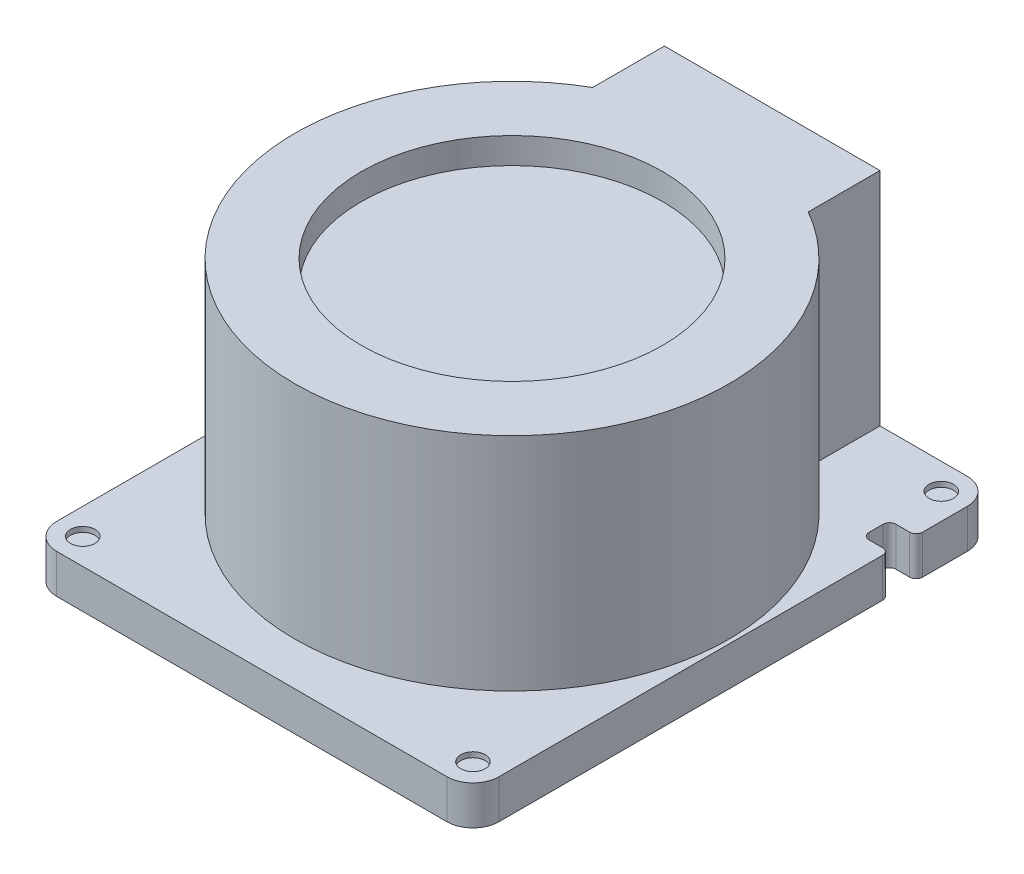
ISO-10303-21;
HEADER;
FILE_DESCRIPTION(('STEP AP214'),'2;1');
FILE_NAME('part.step','',(''),(''),'','','');
FILE_SCHEMA(('AUTOMOTIVE_DESIGN { 1 0 10303 214 1 1 1 1 }'));
ENDSEC;
DATA;
#1=APPLICATION_CONTEXT('core data for automotive mechanical design processes');
#2=APPLICATION_PROTOCOL_DEFINITION('international standard','automotive_design',2000,#1);
#3=PRODUCT_CONTEXT('',#1,'mechanical');
#4=PRODUCT('Part','Part','',(#3));
#5=PRODUCT_RELATED_PRODUCT_CATEGORY('part','',(#4));
#6=PRODUCT_DEFINITION_FORMATION('','',#4);
#7=PRODUCT_DEFINITION_CONTEXT('part definition',#1,'design');
#8=PRODUCT_DEFINITION('design','',#6,#7);
#9=PRODUCT_DEFINITION_SHAPE('','',#8);
#10=(LENGTH_UNIT() NAMED_UNIT(*) SI_UNIT(.MILLI.,.METRE.));
#11=(NAMED_UNIT(*) PLANE_ANGLE_UNIT() SI_UNIT($,.RADIAN.));
#12=(NAMED_UNIT(*) SI_UNIT($,.STERADIAN.) SOLID_ANGLE_UNIT());
#13=UNCERTAINTY_MEASURE_WITH_UNIT(LENGTH_MEASURE(1.E-05),#10,'distance_accuracy_value','');
#14=(GEOMETRIC_REPRESENTATION_CONTEXT(3) GLOBAL_UNCERTAINTY_ASSIGNED_CONTEXT((#13)) GLOBAL_UNIT_ASSIGNED_CONTEXT((#10,
#11,#12)) REPRESENTATION_CONTEXT('',''));
#15=CARTESIAN_POINT('',(0.,0.,0.));
#16=DIRECTION('',(0.,0.,1.));
#17=DIRECTION('',(1.,0.,0.));
#18=AXIS2_PLACEMENT_3D('',#15,#16,#17);
#19=CARTESIAN_POINT('',(-15.,3.,-18.));
#20=DIRECTION('',(0.,-1.,0.));
#21=DIRECTION('',(0.,0.,-1.));
#22=AXIS2_PLACEMENT_3D('',#19,#20,#21);
#23=CYLINDRICAL_SURFACE('',#22,2.);
#24=CARTESIAN_POINT('',(-15.,0.,-18.));
#25=DIRECTION('',(0.,1.,0.));
#26=DIRECTION('',(0.,0.,1.));
#27=AXIS2_PLACEMENT_3D('',#24,#25,#26);
#28=CIRCLE('',#27,2.);
#29=CARTESIAN_POINT('',(-15.,0.,-20.));
#30=VERTEX_POINT('',#29);
#31=CARTESIAN_POINT('',(-17.,0.,-18.));
#32=VERTEX_POINT('',#31);
#33=EDGE_CURVE('E269',#30,#32,#28,.T.);
#34=ORIENTED_EDGE('',*,*,#33,.T.);
#35=DIRECTION('',(0.,-1.,0.));
#36=VECTOR('',#35,1.);
#37=CARTESIAN_POINT('',(-17.,3.,-18.));
#38=LINE('',#37,#36);
#39=CARTESIAN_POINT('',(-17.,3.,-18.));
#40=VERTEX_POINT('',#39);
#41=EDGE_CURVE('E11',#40,#32,#38,.T.);
#42=ORIENTED_EDGE('',*,*,#41,.F.);
#43=CARTESIAN_POINT('',(-15.,3.,-18.));
#44=DIRECTION('',(0.,1.,0.));
#45=DIRECTION('',(0.,0.,1.));
#46=AXIS2_PLACEMENT_3D('',#43,#44,#45);
#47=CIRCLE('',#46,2.);
#48=CARTESIAN_POINT('',(-15.,3.,-20.));
#49=VERTEX_POINT('',#48);
#50=EDGE_CURVE('E272',#49,#40,#47,.T.);
#51=ORIENTED_EDGE('',*,*,#50,.F.);
#52=DIRECTION('',(0.,-1.,0.));
#53=VECTOR('',#52,1.);
#54=CARTESIAN_POINT('',(-15.,3.,-20.));
#55=LINE('',#54,#53);
#56=EDGE_CURVE('E323',#49,#30,#55,.T.);
#57=ORIENTED_EDGE('',*,*,#56,.T.);
#58=EDGE_LOOP('',(#34,#42,#51,#57));
#59=FACE_BOUND('',#58,.T.);
#60=ADVANCED_FACE('F38',(#59),#23,.T.);
#61=CARTESIAN_POINT('',(-17.,3.,-18.));
#62=DIRECTION('',(1.,0.,0.));
#63=DIRECTION('',(0.,0.,-1.));
#64=AXIS2_PLACEMENT_3D('',#61,#62,#63);
#65=PLANE('',#64);
#66=DIRECTION('',(0.,0.,1.));
#67=VECTOR('',#66,1.);
#68=CARTESIAN_POINT('',(-17.,0.,-18.));
#69=LINE('',#68,#67);
#70=CARTESIAN_POINT('',(-17.,0.,-14.5659847542821));
#71=VERTEX_POINT('',#70);
#72=EDGE_CURVE('E326',#32,#71,#69,.T.);
#73=ORIENTED_EDGE('',*,*,#72,.T.);
#74=DIRECTION('',(0.,-1.,0.));
#75=VECTOR('',#74,1.);
#76=CARTESIAN_POINT('',(-17.,3.,-14.5659847542821));
#77=LINE('',#76,#75);
#78=CARTESIAN_POINT('',(-17.,3.,-14.5659847542821));
#79=VERTEX_POINT('',#78);
#80=EDGE_CURVE('E45',#79,#71,#77,.T.);
#81=ORIENTED_EDGE('',*,*,#80,.F.);
#82=DIRECTION('',(0.,0.,1.));
#83=VECTOR('',#82,1.);
#84=CARTESIAN_POINT('',(-17.,3.,-18.));
#85=LINE('',#84,#83);
#86=EDGE_CURVE('E275',#40,#79,#85,.T.);
#87=ORIENTED_EDGE('',*,*,#86,.F.);
#88=ORIENTED_EDGE('',*,*,#41,.T.);
#89=EDGE_LOOP('',(#73,#81,#87,#88));
#90=FACE_BOUND('',#89,.T.);
#91=ADVANCED_FACE('F463',(#90),#65,.F.);
#92=CARTESIAN_POINT('',(-16.5,3.,-14.5659847542821));
#93=DIRECTION('',(0.,-1.,0.));
#94=DIRECTION('',(0.,0.,-1.));
#95=AXIS2_PLACEMENT_3D('',#92,#93,#94);
#96=CYLINDRICAL_SURFACE('',#95,0.499999999999999);
#97=CARTESIAN_POINT('',(-16.5,0.,-14.5659847542821));
#98=DIRECTION('',(0.,1.,0.));
#99=DIRECTION('',(0.,0.,-1.));
#100=AXIS2_PLACEMENT_3D('',#97,#98,#99);
#101=CIRCLE('',#100,0.499999999999999);
#102=CARTESIAN_POINT('',(-16.5,0.,-14.0659847542821));
#103=VERTEX_POINT('',#102);
#104=EDGE_CURVE('E328',#71,#103,#101,.T.);
#105=ORIENTED_EDGE('',*,*,#104,.T.);
#106=DIRECTION('',(0.,-1.,0.));
#107=VECTOR('',#106,1.);
#108=CARTESIAN_POINT('',(-16.5,3.,-14.0659847542821));
#109=LINE('',#108,#107);
#110=CARTESIAN_POINT('',(-16.5,3.,-14.0659847542821));
#111=VERTEX_POINT('',#110);
#112=EDGE_CURVE('E433',#111,#103,#109,.T.);
#113=ORIENTED_EDGE('',*,*,#112,.F.);
#114=CARTESIAN_POINT('',(-16.5,3.,-14.5659847542821));
#115=DIRECTION('',(0.,1.,0.));
#116=DIRECTION('',(0.,0.,-1.));
#117=AXIS2_PLACEMENT_3D('',#114,#115,#116);
#118=CIRCLE('',#117,0.499999999999999);
#119=EDGE_CURVE('E278',#79,#111,#118,.T.);
#120=ORIENTED_EDGE('',*,*,#119,.F.);
#121=ORIENTED_EDGE('',*,*,#80,.T.);
#122=EDGE_LOOP('',(#105,#113,#120,#121));
#123=FACE_BOUND('',#122,.T.);
#124=ADVANCED_FACE('F440',(#123),#96,.T.);
#125=CARTESIAN_POINT('',(-16.5,3.,-14.0659847542821));
#126=DIRECTION('',(0.,0.,-1.));
#127=DIRECTION('',(-1.,0.,0.));
#128=AXIS2_PLACEMENT_3D('',#125,#126,#127);
#129=PLANE('',#128);
#130=DIRECTION('',(1.,0.,0.));
#131=VECTOR('',#130,1.);
#132=CARTESIAN_POINT('',(-16.5,0.,-14.0659847542821));
#133=LINE('',#132,#131);
#134=CARTESIAN_POINT('',(-15.4531939130826,0.,-14.0659847542821));
#135=VERTEX_POINT('',#134);
#136=EDGE_CURVE('E330',#103,#135,#133,.T.);
#137=ORIENTED_EDGE('',*,*,#136,.T.);
#138=DIRECTION('',(0.,-1.,0.));
#139=VECTOR('',#138,1.);
#140=CARTESIAN_POINT('',(-15.4531939130826,3.,-14.0659847542821));
#141=LINE('',#140,#139);
#142=CARTESIAN_POINT('',(-15.4531939130826,3.,-14.0659847542821));
#143=VERTEX_POINT('',#142);
#144=EDGE_CURVE('E430',#143,#135,#141,.T.);
#145=ORIENTED_EDGE('',*,*,#144,.F.);
#146=DIRECTION('',(1.,0.,0.));
#147=VECTOR('',#146,1.);
#148=CARTESIAN_POINT('',(-16.5,3.,-14.0659847542821));
#149=LINE('',#148,#147);
#150=EDGE_CURVE('E280',#111,#143,#149,.T.);
#151=ORIENTED_EDGE('',*,*,#150,.F.);
#152=ORIENTED_EDGE('',*,*,#112,.T.);
#153=EDGE_LOOP('',(#137,#145,#151,#152));
#154=FACE_BOUND('',#153,.T.);
#155=ADVANCED_FACE('F451',(#154),#129,.F.);
#156=CARTESIAN_POINT('',(-15.4531939130826,3.,-13.5659847542821));
#157=DIRECTION('',(0.,-1.,0.));
#158=DIRECTION('',(0.,0.,-1.));
#159=AXIS2_PLACEMENT_3D('',#156,#157,#158);
#160=CYLINDRICAL_SURFACE('',#159,0.5);
#161=CARTESIAN_POINT('',(-15.4531939130826,0.,-13.5659847542821));
#162=DIRECTION('',(0.,-1.,0.));
#163=DIRECTION('',(0.,0.,-1.));
#164=AXIS2_PLACEMENT_3D('',#161,#162,#163);
#165=CIRCLE('',#164,0.5);
#166=CARTESIAN_POINT('',(-14.9531939130826,0.,-13.5659847542821));
#167=VERTEX_POINT('',#166);
#168=EDGE_CURVE('E332',#135,#167,#165,.T.);
#169=ORIENTED_EDGE('',*,*,#168,.T.);
#170=DIRECTION('',(0.,-1.,0.));
#171=VECTOR('',#170,1.);
#172=CARTESIAN_POINT('',(-14.9531939130826,3.,-13.5659847542821));
#173=LINE('',#172,#171);
#174=CARTESIAN_POINT('',(-14.9531939130826,3.,-13.5659847542821));
#175=VERTEX_POINT('',#174);
#176=EDGE_CURVE('E427',#175,#167,#173,.T.);
#177=ORIENTED_EDGE('',*,*,#176,.F.);
#178=CARTESIAN_POINT('',(-15.4531939130826,3.,-13.5659847542821));
#179=DIRECTION('',(0.,-1.,0.));
#180=DIRECTION('',(0.,0.,-1.));
#181=AXIS2_PLACEMENT_3D('',#178,#179,#180);
#182=CIRCLE('',#181,0.5);
#183=EDGE_CURVE('E282',#143,#175,#182,.T.);
#184=ORIENTED_EDGE('',*,*,#183,.F.);
#185=ORIENTED_EDGE('',*,*,#144,.T.);
#186=EDGE_LOOP('',(#169,#177,#184,#185));
#187=FACE_BOUND('',#186,.T.);
#188=ADVANCED_FACE('F455',(#187),#160,.F.);
#189=CARTESIAN_POINT('',(-14.9531939130826,3.,-13.5659847542821));
#190=DIRECTION('',(1.,0.,0.));
#191=DIRECTION('',(0.,0.,-1.));
#192=AXIS2_PLACEMENT_3D('',#189,#190,#191);
#193=PLANE('',#192);
#194=DIRECTION('',(0.,0.,1.));
#195=VECTOR('',#194,1.);
#196=CARTESIAN_POINT('',(-14.9531939130826,0.,-13.5659847542821));
#197=LINE('',#196,#195);
#198=CARTESIAN_POINT('',(-14.9531939130826,0.,-12.4901055567411));
#199=VERTEX_POINT('',#198);
#200=EDGE_CURVE('E334',#167,#199,#197,.T.);
#201=ORIENTED_EDGE('',*,*,#200,.T.);
#202=DIRECTION('',(0.,-1.,0.));
#203=VECTOR('',#202,1.);
#204=CARTESIAN_POINT('',(-14.9531939130826,3.,-12.4901055567411));
#205=LINE('',#204,#203);
#206=CARTESIAN_POINT('',(-14.9531939130826,3.,-12.4901055567411));
#207=VERTEX_POINT('',#206);
#208=EDGE_CURVE('E424',#207,#199,#205,.T.);
#209=ORIENTED_EDGE('',*,*,#208,.F.);
#210=DIRECTION('',(0.,0.,1.));
#211=VECTOR('',#210,1.);
#212=CARTESIAN_POINT('',(-14.9531939130826,3.,-13.5659847542821));
#213=LINE('',#212,#211);
#214=EDGE_CURVE('E284',#175,#207,#213,.T.);
#215=ORIENTED_EDGE('',*,*,#214,.F.);
#216=ORIENTED_EDGE('',*,*,#176,.T.);
#217=EDGE_LOOP('',(#201,#209,#215,#216));
#218=FACE_BOUND('',#217,.T.);
#219=ADVANCED_FACE('F557',(#218),#193,.F.);
#220=CARTESIAN_POINT('',(-15.4531939130826,3.,-12.4901055567411));
#221=DIRECTION('',(0.,-1.,0.));
#222=DIRECTION('',(0.,0.,-1.));
#223=AXIS2_PLACEMENT_3D('',#220,#221,#222);
#224=CYLINDRICAL_SURFACE('',#223,0.5);
#225=CARTESIAN_POINT('',(-15.4531939130826,0.,-12.4901055567411));
#226=DIRECTION('',(0.,-1.,0.));
#227=DIRECTION('',(0.,0.,-1.));
#228=AXIS2_PLACEMENT_3D('',#225,#226,#227);
#229=CIRCLE('',#228,0.5);
#230=CARTESIAN_POINT('',(-15.4531939130826,0.,-11.9901055567411));
#231=VERTEX_POINT('',#230);
#232=EDGE_CURVE('E336',#199,#231,#229,.T.);
#233=ORIENTED_EDGE('',*,*,#232,.T.);
#234=DIRECTION('',(0.,-1.,0.));
#235=VECTOR('',#234,1.);
#236=CARTESIAN_POINT('',(-15.4531939130826,3.,-11.9901055567411));
#237=LINE('',#236,#235);
#238=CARTESIAN_POINT('',(-15.4531939130826,3.,-11.9901055567411));
#239=VERTEX_POINT('',#238);
#240=EDGE_CURVE('E421',#239,#231,#237,.T.);
#241=ORIENTED_EDGE('',*,*,#240,.F.);
#242=CARTESIAN_POINT('',(-15.4531939130826,3.,-12.4901055567411));
#243=DIRECTION('',(0.,-1.,0.));
#244=DIRECTION('',(0.,0.,-1.));
#245=AXIS2_PLACEMENT_3D('',#242,#243,#244);
#246=CIRCLE('',#245,0.5);
#247=EDGE_CURVE('E286',#207,#239,#246,.T.);
#248=ORIENTED_EDGE('',*,*,#247,.F.);
#249=ORIENTED_EDGE('',*,*,#208,.T.);
#250=EDGE_LOOP('',(#233,#241,#248,#249));
#251=FACE_BOUND('',#250,.T.);
#252=ADVANCED_FACE('F555',(#251),#224,.F.);
#253=CARTESIAN_POINT('',(-15.4531939130826,3.,-11.9901055567411));
#254=DIRECTION('',(0.,0.,1.));
#255=DIRECTION('',(1.,0.,0.));
#256=AXIS2_PLACEMENT_3D('',#253,#254,#255);
#257=PLANE('',#256);
#258=DIRECTION('',(-1.,0.,0.));
#259=VECTOR('',#258,1.);
#260=CARTESIAN_POINT('',(-15.4531939130826,0.,-11.9901055567411));
#261=LINE('',#260,#259);
#262=CARTESIAN_POINT('',(-16.5,0.,-11.9901055567411));
#263=VERTEX_POINT('',#262);
#264=EDGE_CURVE('E338',#231,#263,#261,.T.);
#265=ORIENTED_EDGE('',*,*,#264,.T.);
#266=DIRECTION('',(0.,-1.,0.));
#267=VECTOR('',#266,1.);
#268=CARTESIAN_POINT('',(-16.5,3.,-11.9901055567411));
#269=LINE('',#268,#267);
#270=CARTESIAN_POINT('',(-16.5,3.,-11.9901055567411));
#271=VERTEX_POINT('',#270);
#272=EDGE_CURVE('E418',#271,#263,#269,.T.);
#273=ORIENTED_EDGE('',*,*,#272,.F.);
#274=DIRECTION('',(-1.,0.,0.));
#275=VECTOR('',#274,1.);
#276=CARTESIAN_POINT('',(-15.4531939130826,3.,-11.9901055567411));
#277=LINE('',#276,#275);
#278=EDGE_CURVE('E288',#239,#271,#277,.T.);
#279=ORIENTED_EDGE('',*,*,#278,.F.);
#280=ORIENTED_EDGE('',*,*,#240,.T.);
#281=EDGE_LOOP('',(#265,#273,#279,#280));
#282=FACE_BOUND('',#281,.T.);
#283=ADVANCED_FACE('F551',(#282),#257,.F.);
#284=CARTESIAN_POINT('',(-16.5,3.,-11.4901055567411));
#285=DIRECTION('',(0.,-1.,0.));
#286=DIRECTION('',(0.,0.,-1.));
#287=AXIS2_PLACEMENT_3D('',#284,#285,#286);
#288=CYLINDRICAL_SURFACE('',#287,0.5);
#289=CARTESIAN_POINT('',(-16.5,0.,-11.4901055567411));
#290=DIRECTION('',(0.,1.,0.));
#291=DIRECTION('',(0.,0.,1.));
#292=AXIS2_PLACEMENT_3D('',#289,#290,#291);
#293=CIRCLE('',#292,0.5);
#294=CARTESIAN_POINT('',(-17.,0.,-11.4901055567411));
#295=VERTEX_POINT('',#294);
#296=EDGE_CURVE('E340',#263,#295,#293,.T.);
#297=ORIENTED_EDGE('',*,*,#296,.T.);
#298=DIRECTION('',(0.,-1.,0.));
#299=VECTOR('',#298,1.);
#300=CARTESIAN_POINT('',(-17.,3.,-11.4901055567411));
#301=LINE('',#300,#299);
#302=CARTESIAN_POINT('',(-17.,3.,-11.4901055567411));
#303=VERTEX_POINT('',#302);
#304=EDGE_CURVE('E415',#303,#295,#301,.T.);
#305=ORIENTED_EDGE('',*,*,#304,.F.);
#306=CARTESIAN_POINT('',(-16.5,3.,-11.4901055567411));
#307=DIRECTION('',(0.,1.,0.));
#308=DIRECTION('',(0.,0.,1.));
#309=AXIS2_PLACEMENT_3D('',#306,#307,#308);
#310=CIRCLE('',#309,0.5);
#311=EDGE_CURVE('E290',#271,#303,#310,.T.);
#312=ORIENTED_EDGE('',*,*,#311,.F.);
#313=ORIENTED_EDGE('',*,*,#272,.T.);
#314=EDGE_LOOP('',(#297,#305,#312,#313));
#315=FACE_BOUND('',#314,.T.);
#316=ADVANCED_FACE('F546',(#315),#288,.T.);
#317=CARTESIAN_POINT('',(-17.,3.,-11.4901055567411));
#318=DIRECTION('',(1.,0.,0.));
#319=DIRECTION('',(0.,0.,-1.));
#320=AXIS2_PLACEMENT_3D('',#317,#318,#319);
#321=PLANE('',#320);
#322=DIRECTION('',(0.,0.,1.));
#323=VECTOR('',#322,1.);
#324=CARTESIAN_POINT('',(-17.,0.,-11.4901055567411));
#325=LINE('',#324,#323);
#326=CARTESIAN_POINT('',(-17.,0.,18.));
#327=VERTEX_POINT('',#326);
#328=EDGE_CURVE('E342',#295,#327,#325,.T.);
#329=ORIENTED_EDGE('',*,*,#328,.T.);
#330=DIRECTION('',(0.,-1.,0.));
#331=VECTOR('',#330,1.);
#332=CARTESIAN_POINT('',(-17.,3.,18.));
#333=LINE('',#332,#331);
#334=CARTESIAN_POINT('',(-17.,3.,18.));
#335=VERTEX_POINT('',#334);
#336=EDGE_CURVE('E412',#335,#327,#333,.T.);
#337=ORIENTED_EDGE('',*,*,#336,.F.);
#338=DIRECTION('',(0.,0.,1.));
#339=VECTOR('',#338,1.);
#340=CARTESIAN_POINT('',(-17.,3.,-11.4901055567411));
#341=LINE('',#340,#339);
#342=EDGE_CURVE('E292',#303,#335,#341,.T.);
#343=ORIENTED_EDGE('',*,*,#342,.F.);
#344=ORIENTED_EDGE('',*,*,#304,.T.);
#345=EDGE_LOOP('',(#329,#337,#343,#344));
#346=FACE_BOUND('',#345,.T.);
#347=ADVANCED_FACE('F540',(#346),#321,.F.);
#348=CARTESIAN_POINT('',(-15.,3.,18.));
#349=DIRECTION('',(0.,-1.,0.));
#350=DIRECTION('',(0.,0.,-1.));
#351=AXIS2_PLACEMENT_3D('',#348,#349,#350);
#352=CYLINDRICAL_SURFACE('',#351,2.);
#353=CARTESIAN_POINT('',(-15.,0.,18.));
#354=DIRECTION('',(0.,1.,0.));
#355=DIRECTION('',(0.,0.,1.));
#356=AXIS2_PLACEMENT_3D('',#353,#354,#355);
#357=CIRCLE('',#356,2.);
#358=CARTESIAN_POINT('',(-15.,0.,20.));
#359=VERTEX_POINT('',#358);
#360=EDGE_CURVE('E344',#327,#359,#357,.T.);
#361=ORIENTED_EDGE('',*,*,#360,.T.);
#362=DIRECTION('',(0.,-1.,0.));
#363=VECTOR('',#362,1.);
#364=CARTESIAN_POINT('',(-15.,3.,20.));
#365=LINE('',#364,#363);
#366=CARTESIAN_POINT('',(-15.,3.,20.));
#367=VERTEX_POINT('',#366);
#368=EDGE_CURVE('E409',#367,#359,#365,.T.);
#369=ORIENTED_EDGE('',*,*,#368,.F.);
#370=CARTESIAN_POINT('',(-15.,3.,18.));
#371=DIRECTION('',(0.,1.,0.));
#372=DIRECTION('',(0.,0.,1.));
#373=AXIS2_PLACEMENT_3D('',#370,#371,#372);
#374=CIRCLE('',#373,2.);
#375=EDGE_CURVE('E294',#335,#367,#374,.T.);
#376=ORIENTED_EDGE('',*,*,#375,.F.);
#377=ORIENTED_EDGE('',*,*,#336,.T.);
#378=EDGE_LOOP('',(#361,#369,#376,#377));
#379=FACE_BOUND('',#378,.T.);
#380=ADVANCED_FACE('F536',(#379),#352,.T.);
#381=CARTESIAN_POINT('',(-15.,3.,20.));
#382=DIRECTION('',(0.,0.,-1.));
#383=DIRECTION('',(-1.,0.,0.));
#384=AXIS2_PLACEMENT_3D('',#381,#382,#383);
#385=PLANE('',#384);
#386=DIRECTION('',(1.,0.,0.));
#387=VECTOR('',#386,1.);
#388=CARTESIAN_POINT('',(-15.,0.,20.));
#389=LINE('',#388,#387);
#390=CARTESIAN_POINT('',(15.,0.,20.));
#391=VERTEX_POINT('',#390);
#392=EDGE_CURVE('E346',#359,#391,#389,.T.);
#393=ORIENTED_EDGE('',*,*,#392,.T.);
#394=DIRECTION('',(0.,-1.,0.));
#395=VECTOR('',#394,1.);
#396=CARTESIAN_POINT('',(15.,3.,20.));
#397=LINE('',#396,#395);
#398=CARTESIAN_POINT('',(15.,3.,20.));
#399=VERTEX_POINT('',#398);
#400=EDGE_CURVE('E406',#399,#391,#397,.T.);
#401=ORIENTED_EDGE('',*,*,#400,.F.);
#402=DIRECTION('',(1.,0.,0.));
#403=VECTOR('',#402,1.);
#404=CARTESIAN_POINT('',(-15.,3.,20.));
#405=LINE('',#404,#403);
#406=EDGE_CURVE('E296',#367,#399,#405,.T.);
#407=ORIENTED_EDGE('',*,*,#406,.F.);
#408=ORIENTED_EDGE('',*,*,#368,.T.);
#409=EDGE_LOOP('',(#393,#401,#407,#408));
#410=FACE_BOUND('',#409,.T.);
#411=ADVANCED_FACE('F531',(#410),#385,.F.);
#412=CARTESIAN_POINT('',(15.,3.,18.));
#413=DIRECTION('',(0.,-1.,0.));
#414=DIRECTION('',(0.,0.,-1.));
#415=AXIS2_PLACEMENT_3D('',#412,#413,#414);
#416=CYLINDRICAL_SURFACE('',#415,2.);
#417=CARTESIAN_POINT('',(15.,0.,18.));
#418=DIRECTION('',(0.,1.,0.));
#419=DIRECTION('',(0.,0.,1.));
#420=AXIS2_PLACEMENT_3D('',#417,#418,#419);
#421=CIRCLE('',#420,2.);
#422=CARTESIAN_POINT('',(17.,0.,18.));
#423=VERTEX_POINT('',#422);
#424=EDGE_CURVE('E348',#391,#423,#421,.T.);
#425=ORIENTED_EDGE('',*,*,#424,.T.);
#426=DIRECTION('',(0.,-1.,0.));
#427=VECTOR('',#426,1.);
#428=CARTESIAN_POINT('',(17.,3.,18.));
#429=LINE('',#428,#427);
#430=CARTESIAN_POINT('',(17.,3.,18.));
#431=VERTEX_POINT('',#430);
#432=EDGE_CURVE('E403',#431,#423,#429,.T.);
#433=ORIENTED_EDGE('',*,*,#432,.F.);
#434=CARTESIAN_POINT('',(15.,3.,18.));
#435=DIRECTION('',(0.,1.,0.));
#436=DIRECTION('',(0.,0.,1.));
#437=AXIS2_PLACEMENT_3D('',#434,#435,#436);
#438=CIRCLE('',#437,2.);
#439=EDGE_CURVE('E298',#399,#431,#438,.T.);
#440=ORIENTED_EDGE('',*,*,#439,.F.);
#441=ORIENTED_EDGE('',*,*,#400,.T.);
#442=EDGE_LOOP('',(#425,#433,#440,#441));
#443=FACE_BOUND('',#442,.T.);
#444=ADVANCED_FACE('F525',(#443),#416,.T.);
#445=CARTESIAN_POINT('',(17.,3.,-11.4901055567411));
#446=DIRECTION('',(-1.,0.,0.));
#447=DIRECTION('',(0.,0.,1.));
#448=AXIS2_PLACEMENT_3D('',#445,#446,#447);
#449=PLANE('',#448);
#450=DIRECTION('',(0.,0.,-1.));
#451=VECTOR('',#450,1.);
#452=CARTESIAN_POINT('',(17.,0.,-11.4901055567411));
#453=LINE('',#452,#451);
#454=CARTESIAN_POINT('',(17.,0.,-11.4901055567411));
#455=VERTEX_POINT('',#454);
#456=EDGE_CURVE('E350',#423,#455,#453,.T.);
#457=ORIENTED_EDGE('',*,*,#456,.T.);
#458=DIRECTION('',(0.,-1.,0.));
#459=VECTOR('',#458,1.);
#460=CARTESIAN_POINT('',(17.,3.,-11.4901055567411));
#461=LINE('',#460,#459);
#462=CARTESIAN_POINT('',(17.,3.,-11.4901055567411));
#463=VERTEX_POINT('',#462);
#464=EDGE_CURVE('E400',#463,#455,#461,.T.);
#465=ORIENTED_EDGE('',*,*,#464,.F.);
#466=DIRECTION('',(0.,0.,-1.));
#467=VECTOR('',#466,1.);
#468=CARTESIAN_POINT('',(17.,3.,-11.4901055567411));
#469=LINE('',#468,#467);
#470=EDGE_CURVE('E300',#431,#463,#469,.T.);
#471=ORIENTED_EDGE('',*,*,#470,.F.);
#472=ORIENTED_EDGE('',*,*,#432,.T.);
#473=EDGE_LOOP('',(#457,#465,#471,#472));
#474=FACE_BOUND('',#473,.T.);
#475=ADVANCED_FACE('F521',(#474),#449,.F.);
#476=CARTESIAN_POINT('',(16.5,3.,-11.4901055567411));
#477=DIRECTION('',(0.,-1.,0.));
#478=DIRECTION('',(0.,0.,-1.));
#479=AXIS2_PLACEMENT_3D('',#476,#477,#478);
#480=CYLINDRICAL_SURFACE('',#479,0.5);
#481=CARTESIAN_POINT('',(16.5,0.,-11.4901055567411));
#482=DIRECTION('',(0.,1.,0.));
#483=DIRECTION('',(0.,0.,1.));
#484=AXIS2_PLACEMENT_3D('',#481,#482,#483);
#485=CIRCLE('',#484,0.5);
#486=CARTESIAN_POINT('',(16.5,0.,-11.9901055567411));
#487=VERTEX_POINT('',#486);
#488=EDGE_CURVE('E352',#455,#487,#485,.T.);
#489=ORIENTED_EDGE('',*,*,#488,.T.);
#490=DIRECTION('',(0.,-1.,0.));
#491=VECTOR('',#490,1.);
#492=CARTESIAN_POINT('',(16.5,3.,-11.9901055567411));
#493=LINE('',#492,#491);
#494=CARTESIAN_POINT('',(16.5,3.,-11.9901055567411));
#495=VERTEX_POINT('',#494);
#496=EDGE_CURVE('E397',#495,#487,#493,.T.);
#497=ORIENTED_EDGE('',*,*,#496,.F.);
#498=CARTESIAN_POINT('',(16.5,3.,-11.4901055567411));
#499=DIRECTION('',(0.,1.,0.));
#500=DIRECTION('',(0.,0.,1.));
#501=AXIS2_PLACEMENT_3D('',#498,#499,#500);
#502=CIRCLE('',#501,0.5);
#503=EDGE_CURVE('E302',#463,#495,#502,.T.);
#504=ORIENTED_EDGE('',*,*,#503,.F.);
#505=ORIENTED_EDGE('',*,*,#464,.T.);
#506=EDGE_LOOP('',(#489,#497,#504,#505));
#507=FACE_BOUND('',#506,.T.);
#508=ADVANCED_FACE('F516',(#507),#480,.T.);
#509=CARTESIAN_POINT('',(15.4531939130826,3.,-11.9901055567411));
#510=DIRECTION('',(0.,0.,1.));
#511=DIRECTION('',(1.,0.,0.));
#512=AXIS2_PLACEMENT_3D('',#509,#510,#511);
#513=PLANE('',#512);
#514=DIRECTION('',(-1.,0.,0.));
#515=VECTOR('',#514,1.);
#516=CARTESIAN_POINT('',(15.4531939130826,0.,-11.9901055567411));
#517=LINE('',#516,#515);
#518=CARTESIAN_POINT('',(15.4531939130826,0.,-11.9901055567411));
#519=VERTEX_POINT('',#518);
#520=EDGE_CURVE('E354',#487,#519,#517,.T.);
#521=ORIENTED_EDGE('',*,*,#520,.T.);
#522=DIRECTION('',(0.,-1.,0.));
#523=VECTOR('',#522,1.);
#524=CARTESIAN_POINT('',(15.4531939130826,3.,-11.9901055567411));
#525=LINE('',#524,#523);
#526=CARTESIAN_POINT('',(15.4531939130826,3.,-11.9901055567411));
#527=VERTEX_POINT('',#526);
#528=EDGE_CURVE('E394',#527,#519,#525,.T.);
#529=ORIENTED_EDGE('',*,*,#528,.F.);
#530=DIRECTION('',(-1.,0.,0.));
#531=VECTOR('',#530,1.);
#532=CARTESIAN_POINT('',(15.4531939130826,3.,-11.9901055567411));
#533=LINE('',#532,#531);
#534=EDGE_CURVE('E304',#495,#527,#533,.T.);
#535=ORIENTED_EDGE('',*,*,#534,.F.);
#536=ORIENTED_EDGE('',*,*,#496,.T.);
#537=EDGE_LOOP('',(#521,#529,#535,#536));
#538=FACE_BOUND('',#537,.T.);
#539=ADVANCED_FACE('F510',(#538),#513,.F.);
#540=CARTESIAN_POINT('',(15.4531939130826,3.,-12.4901055567411));
#541=DIRECTION('',(0.,-1.,0.));
#542=DIRECTION('',(0.,0.,-1.));
#543=AXIS2_PLACEMENT_3D('',#540,#541,#542);
#544=CYLINDRICAL_SURFACE('',#543,0.5);
#545=CARTESIAN_POINT('',(15.4531939130826,0.,-12.4901055567411));
#546=DIRECTION('',(0.,-1.,0.));
#547=DIRECTION('',(0.,0.,-1.));
#548=AXIS2_PLACEMENT_3D('',#545,#546,#547);
#549=CIRCLE('',#548,0.5);
#550=CARTESIAN_POINT('',(14.9531939130826,0.,-12.4901055567411));
#551=VERTEX_POINT('',#550);
#552=EDGE_CURVE('E356',#519,#551,#549,.T.);
#553=ORIENTED_EDGE('',*,*,#552,.T.);
#554=DIRECTION('',(0.,-1.,0.));
#555=VECTOR('',#554,1.);
#556=CARTESIAN_POINT('',(14.9531939130826,3.,-12.4901055567411));
#557=LINE('',#556,#555);
#558=CARTESIAN_POINT('',(14.9531939130826,3.,-12.4901055567411));
#559=VERTEX_POINT('',#558);
#560=EDGE_CURVE('E391',#559,#551,#557,.T.);
#561=ORIENTED_EDGE('',*,*,#560,.F.);
#562=CARTESIAN_POINT('',(15.4531939130826,3.,-12.4901055567411));
#563=DIRECTION('',(0.,-1.,0.));
#564=DIRECTION('',(0.,0.,-1.));
#565=AXIS2_PLACEMENT_3D('',#562,#563,#564);
#566=CIRCLE('',#565,0.5);
#567=EDGE_CURVE('E306',#527,#559,#566,.T.);
#568=ORIENTED_EDGE('',*,*,#567,.F.);
#569=ORIENTED_EDGE('',*,*,#528,.T.);
#570=EDGE_LOOP('',(#553,#561,#568,#569));
#571=FACE_BOUND('',#570,.T.);
#572=ADVANCED_FACE('F506',(#571),#544,.F.);
#573=CARTESIAN_POINT('',(14.9531939130826,3.,-13.5659847542821));
#574=DIRECTION('',(-1.,0.,0.));
#575=DIRECTION('',(0.,0.,1.));
#576=AXIS2_PLACEMENT_3D('',#573,#574,#575);
#577=PLANE('',#576);
#578=DIRECTION('',(0.,0.,-1.));
#579=VECTOR('',#578,1.);
#580=CARTESIAN_POINT('',(14.9531939130826,0.,-13.5659847542821));
#581=LINE('',#580,#579);
#582=CARTESIAN_POINT('',(14.9531939130826,0.,-13.5659847542821));
#583=VERTEX_POINT('',#582);
#584=EDGE_CURVE('E358',#551,#583,#581,.T.);
#585=ORIENTED_EDGE('',*,*,#584,.T.);
#586=DIRECTION('',(0.,-1.,0.));
#587=VECTOR('',#586,1.);
#588=CARTESIAN_POINT('',(14.9531939130826,3.,-13.5659847542821));
#589=LINE('',#588,#587);
#590=CARTESIAN_POINT('',(14.9531939130826,3.,-13.5659847542821));
#591=VERTEX_POINT('',#590);
#592=EDGE_CURVE('E388',#591,#583,#589,.T.);
#593=ORIENTED_EDGE('',*,*,#592,.F.);
#594=DIRECTION('',(0.,0.,-1.));
#595=VECTOR('',#594,1.);
#596=CARTESIAN_POINT('',(14.9531939130826,3.,-13.5659847542821));
#597=LINE('',#596,#595);
#598=EDGE_CURVE('E308',#559,#591,#597,.T.);
#599=ORIENTED_EDGE('',*,*,#598,.F.);
#600=ORIENTED_EDGE('',*,*,#560,.T.);
#601=EDGE_LOOP('',(#585,#593,#599,#600));
#602=FACE_BOUND('',#601,.T.);
#603=ADVANCED_FACE('F501',(#602),#577,.F.);
#604=CARTESIAN_POINT('',(15.4531939130826,3.,-13.5659847542821));
#605=DIRECTION('',(0.,-1.,0.));
#606=DIRECTION('',(0.,0.,-1.));
#607=AXIS2_PLACEMENT_3D('',#604,#605,#606);
#608=CYLINDRICAL_SURFACE('',#607,0.5);
#609=CARTESIAN_POINT('',(15.4531939130826,0.,-13.5659847542821));
#610=DIRECTION('',(0.,-1.,0.));
#611=DIRECTION('',(0.,0.,-1.));
#612=AXIS2_PLACEMENT_3D('',#609,#610,#611);
#613=CIRCLE('',#612,0.5);
#614=CARTESIAN_POINT('',(15.4531939130826,0.,-14.0659847542821));
#615=VERTEX_POINT('',#614);
#616=EDGE_CURVE('E360',#583,#615,#613,.T.);
#617=ORIENTED_EDGE('',*,*,#616,.T.);
#618=DIRECTION('',(0.,-1.,0.));
#619=VECTOR('',#618,1.);
#620=CARTESIAN_POINT('',(15.4531939130826,3.,-14.0659847542821));
#621=LINE('',#620,#619);
#622=CARTESIAN_POINT('',(15.4531939130826,3.,-14.0659847542821));
#623=VERTEX_POINT('',#622);
#624=EDGE_CURVE('E385',#623,#615,#621,.T.);
#625=ORIENTED_EDGE('',*,*,#624,.F.);
#626=CARTESIAN_POINT('',(15.4531939130826,3.,-13.5659847542821));
#627=DIRECTION('',(0.,-1.,0.));
#628=DIRECTION('',(0.,0.,-1.));
#629=AXIS2_PLACEMENT_3D('',#626,#627,#628);
#630=CIRCLE('',#629,0.5);
#631=EDGE_CURVE('E310',#591,#623,#630,.T.);
#632=ORIENTED_EDGE('',*,*,#631,.F.);
#633=ORIENTED_EDGE('',*,*,#592,.T.);
#634=EDGE_LOOP('',(#617,#625,#632,#633));
#635=FACE_BOUND('',#634,.T.);
#636=ADVANCED_FACE('F495',(#635),#608,.F.);
#637=CARTESIAN_POINT('',(16.5,3.,-14.0659847542821));
#638=DIRECTION('',(0.,0.,-1.));
#639=DIRECTION('',(-1.,0.,0.));
#640=AXIS2_PLACEMENT_3D('',#637,#638,#639);
#641=PLANE('',#640);
#642=DIRECTION('',(1.,0.,0.));
#643=VECTOR('',#642,1.);
#644=CARTESIAN_POINT('',(16.5,0.,-14.0659847542821));
#645=LINE('',#644,#643);
#646=CARTESIAN_POINT('',(16.5,0.,-14.0659847542821));
#647=VERTEX_POINT('',#646);
#648=EDGE_CURVE('E362',#615,#647,#645,.T.);
#649=ORIENTED_EDGE('',*,*,#648,.T.);
#650=DIRECTION('',(0.,-1.,0.));
#651=VECTOR('',#650,1.);
#652=CARTESIAN_POINT('',(16.5,3.,-14.0659847542821));
#653=LINE('',#652,#651);
#654=CARTESIAN_POINT('',(16.5,3.,-14.0659847542821));
#655=VERTEX_POINT('',#654);
#656=EDGE_CURVE('E382',#655,#647,#653,.T.);
#657=ORIENTED_EDGE('',*,*,#656,.F.);
#658=DIRECTION('',(1.,0.,0.));
#659=VECTOR('',#658,1.);
#660=CARTESIAN_POINT('',(16.5,3.,-14.0659847542821));
#661=LINE('',#660,#659);
#662=EDGE_CURVE('E312',#623,#655,#661,.T.);
#663=ORIENTED_EDGE('',*,*,#662,.F.);
#664=ORIENTED_EDGE('',*,*,#624,.T.);
#665=EDGE_LOOP('',(#649,#657,#663,#664));
#666=FACE_BOUND('',#665,.T.);
#667=ADVANCED_FACE('F491',(#666),#641,.F.);
#668=CARTESIAN_POINT('',(16.5,3.,-14.5659847542821));
#669=DIRECTION('',(0.,-1.,0.));
#670=DIRECTION('',(0.,0.,-1.));
#671=AXIS2_PLACEMENT_3D('',#668,#669,#670);
#672=CYLINDRICAL_SURFACE('',#671,0.499999999999999);
#673=CARTESIAN_POINT('',(16.5,0.,-14.5659847542821));
#674=DIRECTION('',(0.,1.,0.));
#675=DIRECTION('',(0.,0.,1.));
#676=AXIS2_PLACEMENT_3D('',#673,#674,#675);
#677=CIRCLE('',#676,0.499999999999999);
#678=CARTESIAN_POINT('',(17.,0.,-14.5659847542821));
#679=VERTEX_POINT('',#678);
#680=EDGE_CURVE('E364',#647,#679,#677,.T.);
#681=ORIENTED_EDGE('',*,*,#680,.T.);
#682=DIRECTION('',(0.,-1.,0.));
#683=VECTOR('',#682,1.);
#684=CARTESIAN_POINT('',(17.,3.,-14.5659847542821));
#685=LINE('',#684,#683);
#686=CARTESIAN_POINT('',(17.,3.,-14.5659847542821));
#687=VERTEX_POINT('',#686);
#688=EDGE_CURVE('E379',#687,#679,#685,.T.);
#689=ORIENTED_EDGE('',*,*,#688,.F.);
#690=CARTESIAN_POINT('',(16.5,3.,-14.5659847542821));
#691=DIRECTION('',(0.,1.,0.));
#692=DIRECTION('',(0.,0.,1.));
#693=AXIS2_PLACEMENT_3D('',#690,#691,#692);
#694=CIRCLE('',#693,0.499999999999999);
#695=EDGE_CURVE('E314',#655,#687,#694,.T.);
#696=ORIENTED_EDGE('',*,*,#695,.F.);
#697=ORIENTED_EDGE('',*,*,#656,.T.);
#698=EDGE_LOOP('',(#681,#689,#696,#697));
#699=FACE_BOUND('',#698,.T.);
#700=ADVANCED_FACE('F486',(#699),#672,.T.);
#701=CARTESIAN_POINT('',(17.,3.,-18.));
#702=DIRECTION('',(-1.,0.,0.));
#703=DIRECTION('',(0.,0.,1.));
#704=AXIS2_PLACEMENT_3D('',#701,#702,#703);
#705=PLANE('',#704);
#706=DIRECTION('',(0.,0.,-1.));
#707=VECTOR('',#706,1.);
#708=CARTESIAN_POINT('',(17.,0.,-18.));
#709=LINE('',#708,#707);
#710=CARTESIAN_POINT('',(17.,0.,-18.));
#711=VERTEX_POINT('',#710);
#712=EDGE_CURVE('E366',#679,#711,#709,.T.);
#713=ORIENTED_EDGE('',*,*,#712,.T.);
#714=DIRECTION('',(0.,-1.,0.));
#715=VECTOR('',#714,1.);
#716=CARTESIAN_POINT('',(17.,3.,-18.));
#717=LINE('',#716,#715);
#718=CARTESIAN_POINT('',(17.,3.,-18.));
#719=VERTEX_POINT('',#718);
#720=EDGE_CURVE('E376',#719,#711,#717,.T.);
#721=ORIENTED_EDGE('',*,*,#720,.F.);
#722=DIRECTION('',(0.,0.,-1.));
#723=VECTOR('',#722,1.);
#724=CARTESIAN_POINT('',(17.,3.,-18.));
#725=LINE('',#724,#723);
#726=EDGE_CURVE('E316',#687,#719,#725,.T.);
#727=ORIENTED_EDGE('',*,*,#726,.F.);
#728=ORIENTED_EDGE('',*,*,#688,.T.);
#729=EDGE_LOOP('',(#713,#721,#727,#728));
#730=FACE_BOUND('',#729,.T.);
#731=ADVANCED_FACE('F480',(#730),#705,.F.);
#732=CARTESIAN_POINT('',(15.,3.,-18.));
#733=DIRECTION('',(0.,-1.,0.));
#734=DIRECTION('',(0.,0.,-1.));
#735=AXIS2_PLACEMENT_3D('',#732,#733,#734);
#736=CYLINDRICAL_SURFACE('',#735,2.);
#737=CARTESIAN_POINT('',(15.,0.,-18.));
#738=DIRECTION('',(0.,1.,0.));
#739=DIRECTION('',(0.,0.,-1.));
#740=AXIS2_PLACEMENT_3D('',#737,#738,#739);
#741=CIRCLE('',#740,2.);
#742=CARTESIAN_POINT('',(15.,0.,-20.));
#743=VERTEX_POINT('',#742);
#744=EDGE_CURVE('E368',#711,#743,#741,.T.);
#745=ORIENTED_EDGE('',*,*,#744,.T.);
#746=DIRECTION('',(0.,-1.,0.));
#747=VECTOR('',#746,1.);
#748=CARTESIAN_POINT('',(15.,3.,-20.));
#749=LINE('',#748,#747);
#750=CARTESIAN_POINT('',(15.,3.,-20.));
#751=VERTEX_POINT('',#750);
#752=EDGE_CURVE('E373',#751,#743,#749,.T.);
#753=ORIENTED_EDGE('',*,*,#752,.F.);
#754=CARTESIAN_POINT('',(15.,3.,-18.));
#755=DIRECTION('',(0.,1.,0.));
#756=DIRECTION('',(0.,0.,-1.));
#757=AXIS2_PLACEMENT_3D('',#754,#755,#756);
#758=CIRCLE('',#757,2.);
#759=EDGE_CURVE('E318',#719,#751,#758,.T.);
#760=ORIENTED_EDGE('',*,*,#759,.F.);
#761=ORIENTED_EDGE('',*,*,#720,.T.);
#762=EDGE_LOOP('',(#745,#753,#760,#761));
#763=FACE_BOUND('',#762,.T.);
#764=ADVANCED_FACE('F476',(#763),#736,.T.);
#765=CARTESIAN_POINT('',(-15.,3.,-20.));
#766=DIRECTION('',(0.,0.,1.));
#767=DIRECTION('',(1.,0.,0.));
#768=AXIS2_PLACEMENT_3D('',#765,#766,#767);
#769=PLANE('',#768);
#770=DIRECTION('',(-1.,0.,0.));
#771=VECTOR('',#770,1.);
#772=CARTESIAN_POINT('',(-15.,0.,-20.));
#773=LINE('',#772,#771);
#774=EDGE_CURVE('E276',#743,#30,#773,.T.);
#775=ORIENTED_EDGE('',*,*,#774,.T.);
#776=ORIENTED_EDGE('',*,*,#56,.F.);
#777=DIRECTION('',(-1.,0.,0.));
#778=VECTOR('',#777,1.);
#779=CARTESIAN_POINT('',(-15.,3.,-20.));
#780=LINE('',#779,#778);
#781=CARTESIAN_POINT('',(-8.28712140467951,3.,-20.));
#782=VERTEX_POINT('',#781);
#783=EDGE_CURVE('E320',#782,#49,#780,.T.);
#784=ORIENTED_EDGE('',*,*,#783,.F.);
#785=DIRECTION('',(0.,-1.,0.));
#786=VECTOR('',#785,1.);
#787=CARTESIAN_POINT('',(-8.28712140467951,20.,-20.));
#788=LINE('',#787,#786);
#789=CARTESIAN_POINT('',(-8.28712140467951,20.,-20.));
#790=VERTEX_POINT('',#789);
#791=EDGE_CURVE('E898',#790,#782,#788,.T.);
#792=ORIENTED_EDGE('',*,*,#791,.F.);
#793=DIRECTION('',(-1.,0.,0.));
#794=VECTOR('',#793,1.);
#795=CARTESIAN_POINT('',(8.28712140467951,20.,-20.));
#796=LINE('',#795,#794);
#797=CARTESIAN_POINT('',(8.28712140467951,20.,-20.));
#798=VERTEX_POINT('',#797);
#799=EDGE_CURVE('E235',#798,#790,#796,.T.);
#800=ORIENTED_EDGE('',*,*,#799,.F.);
#801=DIRECTION('',(0.,-1.,0.));
#802=VECTOR('',#801,1.);
#803=CARTESIAN_POINT('',(8.28712140467951,20.,-20.));
#804=LINE('',#803,#802);
#805=CARTESIAN_POINT('',(8.28712140467951,3.,-20.));
#806=VERTEX_POINT('',#805);
#807=EDGE_CURVE('E247',#798,#806,#804,.T.);
#808=ORIENTED_EDGE('',*,*,#807,.T.);
#809=EDGE_CURVE('E321',#751,#806,#780,.T.);
#810=ORIENTED_EDGE('',*,*,#809,.F.);
#811=ORIENTED_EDGE('',*,*,#752,.T.);
#812=EDGE_LOOP('',(#775,#776,#784,#792,#800,#808,#810,#811));
#813=FACE_BOUND('',#812,.T.);
#814=ADVANCED_FACE('F470',(#813),#769,.F.);
#815=CARTESIAN_POINT('',(-15.,3.,-18.));
#816=DIRECTION('',(0.,1.,0.));
#817=DIRECTION('',(0.,0.,1.));
#818=AXIS2_PLACEMENT_3D('',#815,#816,#817);
#819=PLANE('',#818);
#820=DIRECTION('',(0.,0.,1.));
#821=VECTOR('',#820,1.);
#822=CARTESIAN_POINT('',(-8.28712140467951,3.,-14.4837063015941));
#823=LINE('',#822,#821);
#824=CARTESIAN_POINT('',(-8.2871214046795,3.,-14.4837063015941));
#825=VERTEX_POINT('',#824);
#826=EDGE_CURVE('E57',#782,#825,#823,.T.);
#827=ORIENTED_EDGE('',*,*,#826,.F.);
#828=ORIENTED_EDGE('',*,*,#783,.T.);
#829=ORIENTED_EDGE('',*,*,#50,.T.);
#830=ORIENTED_EDGE('',*,*,#86,.T.);
#831=ORIENTED_EDGE('',*,*,#119,.T.);
#832=ORIENTED_EDGE('',*,*,#150,.T.);
#833=ORIENTED_EDGE('',*,*,#183,.T.);
#834=ORIENTED_EDGE('',*,*,#214,.T.);
#835=ORIENTED_EDGE('',*,*,#247,.T.);
#836=ORIENTED_EDGE('',*,*,#278,.T.);
#837=ORIENTED_EDGE('',*,*,#311,.T.);
#838=ORIENTED_EDGE('',*,*,#342,.T.);
#839=ORIENTED_EDGE('',*,*,#375,.T.);
#840=ORIENTED_EDGE('',*,*,#406,.T.);
#841=ORIENTED_EDGE('',*,*,#439,.T.);
#842=ORIENTED_EDGE('',*,*,#470,.T.);
#843=ORIENTED_EDGE('',*,*,#503,.T.);
#844=ORIENTED_EDGE('',*,*,#534,.T.);
#845=ORIENTED_EDGE('',*,*,#567,.T.);
#846=ORIENTED_EDGE('',*,*,#598,.T.);
#847=ORIENTED_EDGE('',*,*,#631,.T.);
#848=ORIENTED_EDGE('',*,*,#662,.T.);
#849=ORIENTED_EDGE('',*,*,#695,.T.);
#850=ORIENTED_EDGE('',*,*,#726,.T.);
#851=ORIENTED_EDGE('',*,*,#759,.T.);
#852=ORIENTED_EDGE('',*,*,#809,.T.);
#853=DIRECTION('',(0.,0.,-1.));
#854=VECTOR('',#853,1.);
#855=CARTESIAN_POINT('',(8.28712140467951,3.,-14.4837063015941));
#856=LINE('',#855,#854);
#857=CARTESIAN_POINT('',(8.28712140467951,3.,-14.4837063015941));
#858=VERTEX_POINT('',#857);
#859=EDGE_CURVE('E239',#858,#806,#856,.T.);
#860=ORIENTED_EDGE('',*,*,#859,.F.);
#861=CARTESIAN_POINT('',(0.,3.,0.));
#862=DIRECTION('',(0.,1.,0.));
#863=DIRECTION('',(0.,0.,1.));
#864=AXIS2_PLACEMENT_3D('',#861,#862,#863);
#865=CIRCLE('',#864,16.6869448793581);
#866=EDGE_CURVE('E52',#825,#858,#865,.T.);
#867=ORIENTED_EDGE('',*,*,#866,.F.);
#868=EDGE_LOOP('',(#827,#828,#829,#830,#831,#832,#833,#834,#835,#836,#837,#838,#839,#840,#841,
#842,#843,#844,#845,#846,#847,#848,#849,#850,#851,#852,#860,#867));
#869=FACE_BOUND('',#868,.T.);
#870=CARTESIAN_POINT('',(15.,3.,-18.));
#871=DIRECTION('',(0.,1.,0.));
#872=DIRECTION('',(0.,0.,-1.));
#873=AXIS2_PLACEMENT_3D('',#870,#871,#872);
#874=CIRCLE('',#873,0.938992971569167);
#875=CARTESIAN_POINT('',(15.,3.,-18.9389929715692));
#876=VERTEX_POINT('',#875);
#877=EDGE_CURVE('E242',#876,#876,#874,.T.);
#878=ORIENTED_EDGE('',*,*,#877,.F.);
#879=EDGE_LOOP('',(#878));
#880=FACE_BOUND('',#879,.T.);
#881=CARTESIAN_POINT('',(15.,3.,18.));
#882=DIRECTION('',(0.,1.,0.));
#883=DIRECTION('',(0.,0.,1.));
#884=AXIS2_PLACEMENT_3D('',#881,#882,#883);
#885=CIRCLE('',#884,0.938992971569167);
#886=CARTESIAN_POINT('',(15.,3.,18.9389929715692));
#887=VERTEX_POINT('',#886);
#888=EDGE_CURVE('E261',#887,#887,#885,.T.);
#889=ORIENTED_EDGE('',*,*,#888,.F.);
#890=EDGE_LOOP('',(#889));
#891=FACE_BOUND('',#890,.T.);
#892=CARTESIAN_POINT('',(-15.,3.,18.));
#893=DIRECTION('',(0.,1.,0.));
#894=DIRECTION('',(0.,0.,-1.));
#895=AXIS2_PLACEMENT_3D('',#892,#893,#894);
#896=CIRCLE('',#895,0.938992971569167);
#897=CARTESIAN_POINT('',(-15.,3.,17.0610070284308));
#898=VERTEX_POINT('',#897);
#899=EDGE_CURVE('E255',#898,#898,#896,.T.);
#900=ORIENTED_EDGE('',*,*,#899,.F.);
#901=EDGE_LOOP('',(#900));
#902=FACE_BOUND('',#901,.T.);
#903=CARTESIAN_POINT('',(-15.,3.,-18.));
#904=DIRECTION('',(0.,1.,0.));
#905=DIRECTION('',(0.,0.,1.));
#906=AXIS2_PLACEMENT_3D('',#903,#904,#905);
#907=CIRCLE('',#906,0.938992971569167);
#908=CARTESIAN_POINT('',(-15.,3.,-17.0610070284308));
#909=VERTEX_POINT('',#908);
#910=EDGE_CURVE('E254',#909,#909,#907,.T.);
#911=ORIENTED_EDGE('',*,*,#910,.F.);
#912=EDGE_LOOP('',(#911));
#913=FACE_BOUND('',#912,.T.);
#914=ADVANCED_FACE('F458',(#869,#880,#891,#902,#913),#819,.T.);
#915=CARTESIAN_POINT('',(-15.,0.,-18.));
#916=DIRECTION('',(0.,1.,0.));
#917=DIRECTION('',(0.,0.,1.));
#918=AXIS2_PLACEMENT_3D('',#915,#916,#917);
#919=PLANE('',#918);
#920=ORIENTED_EDGE('',*,*,#33,.F.);
#921=ORIENTED_EDGE('',*,*,#774,.F.);
#922=ORIENTED_EDGE('',*,*,#744,.F.);
#923=ORIENTED_EDGE('',*,*,#712,.F.);
#924=ORIENTED_EDGE('',*,*,#680,.F.);
#925=ORIENTED_EDGE('',*,*,#648,.F.);
#926=ORIENTED_EDGE('',*,*,#616,.F.);
#927=ORIENTED_EDGE('',*,*,#584,.F.);
#928=ORIENTED_EDGE('',*,*,#552,.F.);
#929=ORIENTED_EDGE('',*,*,#520,.F.);
#930=ORIENTED_EDGE('',*,*,#488,.F.);
#931=ORIENTED_EDGE('',*,*,#456,.F.);
#932=ORIENTED_EDGE('',*,*,#424,.F.);
#933=ORIENTED_EDGE('',*,*,#392,.F.);
#934=ORIENTED_EDGE('',*,*,#360,.F.);
#935=ORIENTED_EDGE('',*,*,#328,.F.);
#936=ORIENTED_EDGE('',*,*,#296,.F.);
#937=ORIENTED_EDGE('',*,*,#264,.F.);
#938=ORIENTED_EDGE('',*,*,#232,.F.);
#939=ORIENTED_EDGE('',*,*,#200,.F.);
#940=ORIENTED_EDGE('',*,*,#168,.F.);
#941=ORIENTED_EDGE('',*,*,#136,.F.);
#942=ORIENTED_EDGE('',*,*,#104,.F.);
#943=ORIENTED_EDGE('',*,*,#72,.F.);
#944=EDGE_LOOP('',(#920,#921,#922,#923,#924,#925,#926,#927,#928,#929,#930,#931,#932,#933,#934,
#935,#936,#937,#938,#939,#940,#941,#942,#943));
#945=FACE_BOUND('',#944,.T.);
#946=ADVANCED_FACE('F446',(#945),#919,.F.);
#947=CARTESIAN_POINT('',(-15.,2.6,-18.));
#948=DIRECTION('',(0.,1.,0.));
#949=DIRECTION('',(0.,0.,1.));
#950=AXIS2_PLACEMENT_3D('',#947,#948,#949);
#951=CYLINDRICAL_SURFACE('',#950,0.938992971569167);
#952=CARTESIAN_POINT('',(-15.,2.6,-18.));
#953=DIRECTION('',(0.,1.,0.));
#954=DIRECTION('',(0.,0.,1.));
#955=AXIS2_PLACEMENT_3D('',#952,#953,#954);
#956=CIRCLE('',#955,0.938992971569167);
#957=CARTESIAN_POINT('',(-15.,2.6,-17.0610070284308));
#958=VERTEX_POINT('',#957);
#959=EDGE_CURVE('E266',#958,#958,#956,.T.);
#960=ORIENTED_EDGE('',*,*,#959,.F.);
#961=EDGE_LOOP('',(#960));
#962=FACE_BOUND('',#961,.T.);
#963=ORIENTED_EDGE('',*,*,#910,.T.);
#964=EDGE_LOOP('',(#963));
#965=FACE_BOUND('',#964,.T.);
#966=ADVANCED_FACE('F733',(#962,#965),#951,.F.);
#967=CARTESIAN_POINT('',(-15.,2.6,-18.));
#968=DIRECTION('',(0.,1.,0.));
#969=DIRECTION('',(0.,0.,1.));
#970=AXIS2_PLACEMENT_3D('',#967,#968,#969);
#971=PLANE('',#970);
#972=ORIENTED_EDGE('',*,*,#959,.T.);
#973=EDGE_LOOP('',(#972));
#974=FACE_BOUND('',#973,.T.);
#975=ADVANCED_FACE('F744',(#974),#971,.T.);
#976=CARTESIAN_POINT('',(-15.,2.6,18.));
#977=DIRECTION('',(0.,1.,0.));
#978=DIRECTION('',(0.,0.,1.));
#979=AXIS2_PLACEMENT_3D('',#976,#977,#978);
#980=CYLINDRICAL_SURFACE('',#979,0.938992971569167);
#981=CARTESIAN_POINT('',(-15.,2.6,18.));
#982=DIRECTION('',(0.,1.,0.));
#983=DIRECTION('',(0.,0.,-1.));
#984=AXIS2_PLACEMENT_3D('',#981,#982,#983);
#985=CIRCLE('',#984,0.938992971569167);
#986=CARTESIAN_POINT('',(-15.,2.6,17.0610070284308));
#987=VERTEX_POINT('',#986);
#988=EDGE_CURVE('E251',#987,#987,#985,.T.);
#989=ORIENTED_EDGE('',*,*,#988,.F.);
#990=EDGE_LOOP('',(#989));
#991=FACE_BOUND('',#990,.T.);
#992=ORIENTED_EDGE('',*,*,#899,.T.);
#993=EDGE_LOOP('',(#992));
#994=FACE_BOUND('',#993,.T.);
#995=ADVANCED_FACE('F754',(#991,#994),#980,.F.);
#996=CARTESIAN_POINT('',(-15.,2.6,18.));
#997=DIRECTION('',(0.,-1.,0.));
#998=DIRECTION('',(0.,0.,-1.));
#999=AXIS2_PLACEMENT_3D('',#996,#997,#998);
#1000=PLANE('',#999);
#1001=ORIENTED_EDGE('',*,*,#988,.T.);
#1002=EDGE_LOOP('',(#1001));
#1003=FACE_BOUND('',#1002,.T.);
#1004=ADVANCED_FACE('F764',(#1003),#1000,.F.);
#1005=CARTESIAN_POINT('',(15.,2.6,18.));
#1006=DIRECTION('',(0.,1.,0.));
#1007=DIRECTION('',(0.,0.,1.));
#1008=AXIS2_PLACEMENT_3D('',#1005,#1006,#1007);
#1009=CYLINDRICAL_SURFACE('',#1008,0.938992971569167);
#1010=CARTESIAN_POINT('',(15.,2.6,18.));
#1011=DIRECTION('',(0.,1.,0.));
#1012=DIRECTION('',(0.,0.,1.));
#1013=AXIS2_PLACEMENT_3D('',#1010,#1011,#1012);
#1014=CIRCLE('',#1013,0.938992971569167);
#1015=CARTESIAN_POINT('',(15.,2.6,18.9389929715692));
#1016=VERTEX_POINT('',#1015);
#1017=EDGE_CURVE('E258',#1016,#1016,#1014,.T.);
#1018=ORIENTED_EDGE('',*,*,#1017,.F.);
#1019=EDGE_LOOP('',(#1018));
#1020=FACE_BOUND('',#1019,.T.);
#1021=ORIENTED_EDGE('',*,*,#888,.T.);
#1022=EDGE_LOOP('',(#1021));
#1023=FACE_BOUND('',#1022,.T.);
#1024=ADVANCED_FACE('F774',(#1020,#1023),#1009,.F.);
#1025=CARTESIAN_POINT('',(15.,2.6,18.));
#1026=DIRECTION('',(0.,1.,0.));
#1027=DIRECTION('',(0.,0.,1.));
#1028=AXIS2_PLACEMENT_3D('',#1025,#1026,#1027);
#1029=PLANE('',#1028);
#1030=ORIENTED_EDGE('',*,*,#1017,.T.);
#1031=EDGE_LOOP('',(#1030));
#1032=FACE_BOUND('',#1031,.T.);
#1033=ADVANCED_FACE('F784',(#1032),#1029,.T.);
#1034=CARTESIAN_POINT('',(15.,2.6,-18.));
#1035=DIRECTION('',(0.,1.,0.));
#1036=DIRECTION('',(0.,0.,1.));
#1037=AXIS2_PLACEMENT_3D('',#1034,#1035,#1036);
#1038=CYLINDRICAL_SURFACE('',#1037,0.938992971569167);
#1039=CARTESIAN_POINT('',(15.,2.6,-18.));
#1040=DIRECTION('',(0.,1.,0.));
#1041=DIRECTION('',(0.,0.,-1.));
#1042=AXIS2_PLACEMENT_3D('',#1039,#1040,#1041);
#1043=CIRCLE('',#1042,0.938992971569167);
#1044=CARTESIAN_POINT('',(15.,2.6,-18.9389929715692));
#1045=VERTEX_POINT('',#1044);
#1046=EDGE_CURVE('E245',#1045,#1045,#1043,.T.);
#1047=ORIENTED_EDGE('',*,*,#1046,.F.);
#1048=EDGE_LOOP('',(#1047));
#1049=FACE_BOUND('',#1048,.T.);
#1050=ORIENTED_EDGE('',*,*,#877,.T.);
#1051=EDGE_LOOP('',(#1050));
#1052=FACE_BOUND('',#1051,.T.);
#1053=ADVANCED_FACE('F794',(#1049,#1052),#1038,.F.);
#1054=CARTESIAN_POINT('',(15.,2.6,-18.));
#1055=DIRECTION('',(0.,-1.,0.));
#1056=DIRECTION('',(0.,0.,-1.));
#1057=AXIS2_PLACEMENT_3D('',#1054,#1055,#1056);
#1058=PLANE('',#1057);
#1059=ORIENTED_EDGE('',*,*,#1046,.T.);
#1060=EDGE_LOOP('',(#1059));
#1061=FACE_BOUND('',#1060,.T.);
#1062=ADVANCED_FACE('F804',(#1061),#1058,.F.);
#1063=CARTESIAN_POINT('',(-8.28712140467951,20.,-14.4837063015941));
#1064=DIRECTION('',(1.,0.,0.));
#1065=DIRECTION('',(0.,0.,-1.));
#1066=AXIS2_PLACEMENT_3D('',#1063,#1064,#1065);
#1067=PLANE('',#1066);
#1068=ORIENTED_EDGE('',*,*,#826,.T.);
#1069=DIRECTION('',(0.,-1.,0.));
#1070=VECTOR('',#1069,1.);
#1071=CARTESIAN_POINT('',(-8.2871214046795,20.,-14.4837063015941));
#1072=LINE('',#1071,#1070);
#1073=CARTESIAN_POINT('',(-8.2871214046795,20.,-14.4837063015941));
#1074=VERTEX_POINT('',#1073);
#1075=EDGE_CURVE('E224',#1074,#825,#1072,.T.);
#1076=ORIENTED_EDGE('',*,*,#1075,.F.);
#1077=DIRECTION('',(0.,0.,1.));
#1078=VECTOR('',#1077,1.);
#1079=CARTESIAN_POINT('',(-8.28712140467951,20.,-14.4837063015941));
#1080=LINE('',#1079,#1078);
#1081=EDGE_CURVE('E230',#790,#1074,#1080,.T.);
#1082=ORIENTED_EDGE('',*,*,#1081,.F.);
#1083=ORIENTED_EDGE('',*,*,#791,.T.);
#1084=EDGE_LOOP('',(#1068,#1076,#1082,#1083));
#1085=FACE_BOUND('',#1084,.T.);
#1086=ADVANCED_FACE('F241',(#1085),#1067,.F.);
#1087=CARTESIAN_POINT('',(0.,20.,0.));
#1088=DIRECTION('',(0.,-1.,0.));
#1089=DIRECTION('',(0.,0.,-1.));
#1090=AXIS2_PLACEMENT_3D('',#1087,#1088,#1089);
#1091=CYLINDRICAL_SURFACE('',#1090,16.6869448793581);
#1092=ORIENTED_EDGE('',*,*,#866,.T.);
#1093=DIRECTION('',(0.,-1.,0.));
#1094=VECTOR('',#1093,1.);
#1095=CARTESIAN_POINT('',(8.28712140467951,20.,-14.4837063015941));
#1096=LINE('',#1095,#1094);
#1097=CARTESIAN_POINT('',(8.28712140467951,20.,-14.4837063015941));
#1098=VERTEX_POINT('',#1097);
#1099=EDGE_CURVE('E226',#1098,#858,#1096,.T.);
#1100=ORIENTED_EDGE('',*,*,#1099,.F.);
#1101=CARTESIAN_POINT('',(0.,20.,0.));
#1102=DIRECTION('',(0.,1.,0.));
#1103=DIRECTION('',(0.,0.,1.));
#1104=AXIS2_PLACEMENT_3D('',#1101,#1102,#1103);
#1105=CIRCLE('',#1104,16.6869448793581);
#1106=EDGE_CURVE('E220',#1074,#1098,#1105,.T.);
#1107=ORIENTED_EDGE('',*,*,#1106,.F.);
#1108=ORIENTED_EDGE('',*,*,#1075,.T.);
#1109=EDGE_LOOP('',(#1092,#1100,#1107,#1108));
#1110=FACE_BOUND('',#1109,.T.);
#1111=ADVANCED_FACE('F222',(#1110),#1091,.T.);
#1112=CARTESIAN_POINT('',(8.28712140467951,20.,-14.4837063015941));
#1113=DIRECTION('',(-1.,0.,0.));
#1114=DIRECTION('',(0.,0.,1.));
#1115=AXIS2_PLACEMENT_3D('',#1112,#1113,#1114);
#1116=PLANE('',#1115);
#1117=ORIENTED_EDGE('',*,*,#859,.T.);
#1118=ORIENTED_EDGE('',*,*,#807,.F.);
#1119=DIRECTION('',(0.,0.,-1.));
#1120=VECTOR('',#1119,1.);
#1121=CARTESIAN_POINT('',(8.28712140467951,20.,-14.4837063015941));
#1122=LINE('',#1121,#1120);
#1123=EDGE_CURVE('E229',#1098,#798,#1122,.T.);
#1124=ORIENTED_EDGE('',*,*,#1123,.F.);
#1125=ORIENTED_EDGE('',*,*,#1099,.T.);
#1126=EDGE_LOOP('',(#1117,#1118,#1124,#1125));
#1127=FACE_BOUND('',#1126,.T.);
#1128=ADVANCED_FACE('F844',(#1127),#1116,.F.);
#1129=CARTESIAN_POINT('',(0.,20.,0.));
#1130=DIRECTION('',(0.,1.,0.));
#1131=DIRECTION('',(0.,0.,1.));
#1132=AXIS2_PLACEMENT_3D('',#1129,#1130,#1131);
#1133=PLANE('',#1132);
#1134=CARTESIAN_POINT('',(0.,20.,0.));
#1135=DIRECTION('',(0.,1.,0.));
#1136=DIRECTION('',(0.,0.,1.));
#1137=AXIS2_PLACEMENT_3D('',#1134,#1135,#1136);
#1138=CIRCLE('',#1137,11.5786020232295);
#1139=CARTESIAN_POINT('',(0.,20.,11.5786020232295));
#1140=VERTEX_POINT('',#1139);
#1141=EDGE_CURVE('E891',#1140,#1140,#1138,.T.);
#1142=ORIENTED_EDGE('',*,*,#1141,.F.);
#1143=EDGE_LOOP('',(#1142));
#1144=FACE_BOUND('',#1143,.T.);
#1145=ORIENTED_EDGE('',*,*,#1081,.T.);
#1146=ORIENTED_EDGE('',*,*,#1106,.T.);
#1147=ORIENTED_EDGE('',*,*,#1123,.T.);
#1148=ORIENTED_EDGE('',*,*,#799,.T.);
#1149=EDGE_LOOP('',(#1145,#1146,#1147,#1148));
#1150=FACE_BOUND('',#1149,.T.);
#1151=ADVANCED_FACE('F233',(#1144,#1150),#1133,.T.);
#1152=CARTESIAN_POINT('',(0.,18.,0.));
#1153=DIRECTION('',(0.,1.,0.));
#1154=DIRECTION('',(0.,0.,1.));
#1155=AXIS2_PLACEMENT_3D('',#1152,#1153,#1154);
#1156=CYLINDRICAL_SURFACE('',#1155,11.5786020232295);
#1157=CARTESIAN_POINT('',(0.,18.,0.));
#1158=DIRECTION('',(0.,1.,0.));
#1159=DIRECTION('',(0.,0.,1.));
#1160=AXIS2_PLACEMENT_3D('',#1157,#1158,#1159);
#1161=CIRCLE('',#1160,11.5786020232295);
#1162=CARTESIAN_POINT('',(0.,18.,11.5786020232295));
#1163=VERTEX_POINT('',#1162);
#1164=EDGE_CURVE('E890',#1163,#1163,#1161,.T.);
#1165=ORIENTED_EDGE('',*,*,#1164,.F.);
#1166=EDGE_LOOP('',(#1165));
#1167=FACE_BOUND('',#1166,.T.);
#1168=ORIENTED_EDGE('',*,*,#1141,.T.);
#1169=EDGE_LOOP('',(#1168));
#1170=FACE_BOUND('',#1169,.T.);
#1171=ADVANCED_FACE('F862',(#1167,#1170),#1156,.F.);
#1172=CARTESIAN_POINT('',(0.,18.,0.));
#1173=DIRECTION('',(0.,1.,0.));
#1174=DIRECTION('',(0.,0.,1.));
#1175=AXIS2_PLACEMENT_3D('',#1172,#1173,#1174);
#1176=PLANE('',#1175);
#1177=ORIENTED_EDGE('',*,*,#1164,.T.);
#1178=EDGE_LOOP('',(#1177));
#1179=FACE_BOUND('',#1178,.T.);
#1180=ADVANCED_FACE('F872',(#1179),#1176,.T.);
#1181=CLOSED_SHELL('',(#60,#91,#124,#155,#188,#219,#252,#283,#316,#347,#380,#411,#444,#475,#508,
#539,#572,#603,#636,#667,#700,#731,#764,#814,#914,#946,#966,#975,#995,#1004,#1024,#1033,#1053,
#1062,#1086,#1111,#1128,#1151,#1171,#1180));
#1182=MANIFOLD_SOLID_BREP('B2',#1181);
#1183=ADVANCED_BREP_SHAPE_REPRESENTATION('',(#18,#1182),#14);
#1184=SHAPE_DEFINITION_REPRESENTATION(#9,#1183);
ENDSEC;
END-ISO-10303-21;
